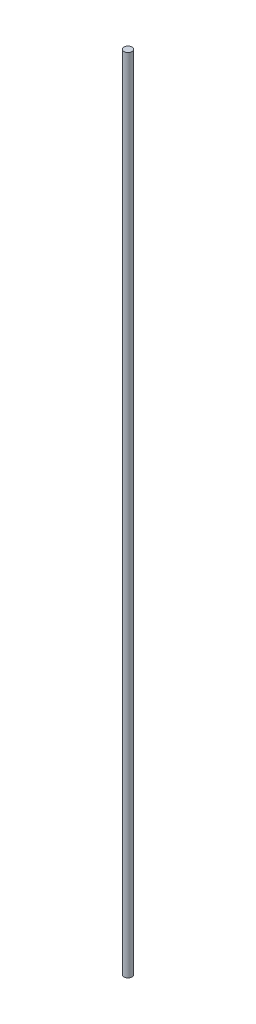
ISO-10303-21;
HEADER;
FILE_DESCRIPTION(('STEP AP214'),'2;1');
FILE_NAME('part.step','',(''),(''),'','','');
FILE_SCHEMA(('AUTOMOTIVE_DESIGN { 1 0 10303 214 1 1 1 1 }'));
ENDSEC;
DATA;
#1=APPLICATION_CONTEXT('core data for automotive mechanical design processes');
#2=APPLICATION_PROTOCOL_DEFINITION('international standard','automotive_design',2000,#1);
#3=PRODUCT_CONTEXT('',#1,'mechanical');
#4=PRODUCT('Part','Part','',(#3));
#5=PRODUCT_RELATED_PRODUCT_CATEGORY('part','',(#4));
#6=PRODUCT_DEFINITION_FORMATION('','',#4);
#7=PRODUCT_DEFINITION_CONTEXT('part definition',#1,'design');
#8=PRODUCT_DEFINITION('design','',#6,#7);
#9=PRODUCT_DEFINITION_SHAPE('','',#8);
#10=(LENGTH_UNIT() NAMED_UNIT(*) SI_UNIT(.MILLI.,.METRE.));
#11=(NAMED_UNIT(*) PLANE_ANGLE_UNIT() SI_UNIT($,.RADIAN.));
#12=(NAMED_UNIT(*) SI_UNIT($,.STERADIAN.) SOLID_ANGLE_UNIT());
#13=UNCERTAINTY_MEASURE_WITH_UNIT(LENGTH_MEASURE(1.E-05),#10,'distance_accuracy_value','');
#14=(GEOMETRIC_REPRESENTATION_CONTEXT(3) GLOBAL_UNCERTAINTY_ASSIGNED_CONTEXT((#13)) GLOBAL_UNIT_ASSIGNED_CONTEXT((#10,
#11,#12)) REPRESENTATION_CONTEXT('',''));
#15=CARTESIAN_POINT('',(0.,0.,0.));
#16=DIRECTION('',(0.,0.,1.));
#17=DIRECTION('',(1.,0.,0.));
#18=AXIS2_PLACEMENT_3D('',#15,#16,#17);
#19=CARTESIAN_POINT('',(0.,400.,0.));
#20=DIRECTION('',(0.,-1.,0.));
#21=DIRECTION('',(0.,0.,-1.));
#22=AXIS2_PLACEMENT_3D('',#19,#20,#21);
#23=CYLINDRICAL_SURFACE('',#22,2.);
#24=CARTESIAN_POINT('',(0.,400.,0.));
#25=DIRECTION('',(0.,1.,0.));
#26=DIRECTION('',(0.,0.,1.));
#27=AXIS2_PLACEMENT_3D('',#24,#25,#26);
#28=CIRCLE('',#27,2.);
#29=CARTESIAN_POINT('',(0.,400.,2.));
#30=VERTEX_POINT('',#29);
#31=EDGE_CURVE('E10',#30,#30,#28,.T.);
#32=ORIENTED_EDGE('',*,*,#31,.F.);
#33=EDGE_LOOP('',(#32));
#34=FACE_BOUND('',#33,.T.);
#35=CARTESIAN_POINT('',(0.,0.,0.));
#36=DIRECTION('',(0.,1.,0.));
#37=DIRECTION('',(0.,0.,1.));
#38=AXIS2_PLACEMENT_3D('',#35,#36,#37);
#39=CIRCLE('',#38,2.);
#40=CARTESIAN_POINT('',(0.,0.,2.));
#41=VERTEX_POINT('',#40);
#42=EDGE_CURVE('E36',#41,#41,#39,.T.);
#43=ORIENTED_EDGE('',*,*,#42,.T.);
#44=EDGE_LOOP('',(#43));
#45=FACE_BOUND('',#44,.T.);
#46=ADVANCED_FACE('F33',(#34,#45),#23,.T.);
#47=CARTESIAN_POINT('',(0.,400.,0.));
#48=DIRECTION('',(0.,1.,0.));
#49=DIRECTION('',(0.,0.,1.));
#50=AXIS2_PLACEMENT_3D('',#47,#48,#49);
#51=PLANE('',#50);
#52=ORIENTED_EDGE('',*,*,#31,.T.);
#53=EDGE_LOOP('',(#52));
#54=FACE_BOUND('',#53,.T.);
#55=ADVANCED_FACE('F48',(#54),#51,.T.);
#56=CARTESIAN_POINT('',(0.,0.,0.));
#57=DIRECTION('',(0.,1.,0.));
#58=DIRECTION('',(0.,0.,1.));
#59=AXIS2_PLACEMENT_3D('',#56,#57,#58);
#60=PLANE('',#59);
#61=ORIENTED_EDGE('',*,*,#42,.F.);
#62=EDGE_LOOP('',(#61));
#63=FACE_BOUND('',#62,.T.);
#64=ADVANCED_FACE('F46',(#63),#60,.F.);
#65=CLOSED_SHELL('',(#46,#55,#64));
#66=MANIFOLD_SOLID_BREP('B2',#65);
#67=ADVANCED_BREP_SHAPE_REPRESENTATION('',(#18,#66),#14);
#68=SHAPE_DEFINITION_REPRESENTATION(#9,#67);
ENDSEC;
END-ISO-10303-21;
